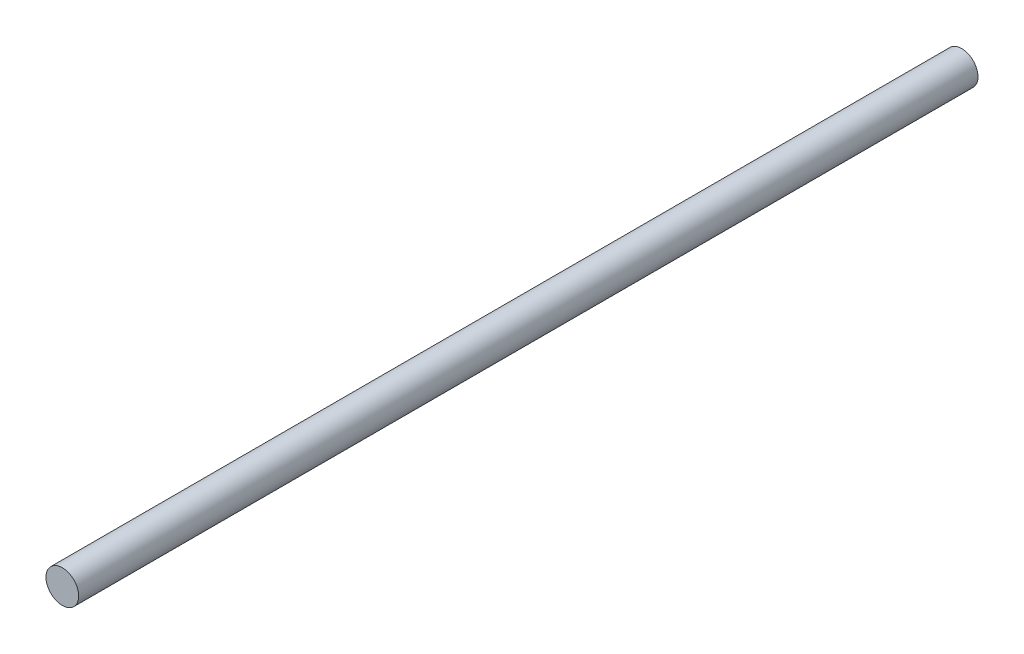
ISO-10303-21;
HEADER;
FILE_DESCRIPTION(('STEP AP214'),'2;1');
FILE_NAME('part.step','',(''),(''),'','','');
FILE_SCHEMA(('AUTOMOTIVE_DESIGN { 1 0 10303 214 1 1 1 1 }'));
ENDSEC;
DATA;
#1=APPLICATION_CONTEXT('core data for automotive mechanical design processes');
#2=APPLICATION_PROTOCOL_DEFINITION('international standard','automotive_design',2000,#1);
#3=PRODUCT_CONTEXT('',#1,'mechanical');
#4=PRODUCT('Part','Part','',(#3));
#5=PRODUCT_RELATED_PRODUCT_CATEGORY('part','',(#4));
#6=PRODUCT_DEFINITION_FORMATION('','',#4);
#7=PRODUCT_DEFINITION_CONTEXT('part definition',#1,'design');
#8=PRODUCT_DEFINITION('design','',#6,#7);
#9=PRODUCT_DEFINITION_SHAPE('','',#8);
#10=(LENGTH_UNIT() NAMED_UNIT(*) SI_UNIT(.MILLI.,.METRE.));
#11=(NAMED_UNIT(*) PLANE_ANGLE_UNIT() SI_UNIT($,.RADIAN.));
#12=(NAMED_UNIT(*) SI_UNIT($,.STERADIAN.) SOLID_ANGLE_UNIT());
#13=UNCERTAINTY_MEASURE_WITH_UNIT(LENGTH_MEASURE(1.E-05),#10,'distance_accuracy_value','');
#14=(GEOMETRIC_REPRESENTATION_CONTEXT(3) GLOBAL_UNCERTAINTY_ASSIGNED_CONTEXT((#13)) GLOBAL_UNIT_ASSIGNED_CONTEXT((#10,
#11,#12)) REPRESENTATION_CONTEXT('',''));
#15=CARTESIAN_POINT('',(0.,0.,0.));
#16=DIRECTION('',(0.,0.,1.));
#17=DIRECTION('',(1.,0.,0.));
#18=AXIS2_PLACEMENT_3D('',#15,#16,#17);
#19=CARTESIAN_POINT('',(0.,0.,220.));
#20=DIRECTION('',(0.,0.,-1.));
#21=DIRECTION('',(-1.,0.,0.));
#22=AXIS2_PLACEMENT_3D('',#19,#20,#21);
#23=CYLINDRICAL_SURFACE('',#22,4.);
#24=CARTESIAN_POINT('',(0.,0.,220.));
#25=DIRECTION('',(0.,0.,1.));
#26=DIRECTION('',(1.,0.,0.));
#27=AXIS2_PLACEMENT_3D('',#24,#25,#26);
#28=CIRCLE('',#27,4.);
#29=CARTESIAN_POINT('',(4.,0.,220.));
#30=VERTEX_POINT('',#29);
#31=EDGE_CURVE('E10',#30,#30,#28,.T.);
#32=ORIENTED_EDGE('',*,*,#31,.F.);
#33=EDGE_LOOP('',(#32));
#34=FACE_BOUND('',#33,.T.);
#35=CARTESIAN_POINT('',(0.,0.,0.));
#36=DIRECTION('',(0.,0.,1.));
#37=DIRECTION('',(1.,0.,0.));
#38=AXIS2_PLACEMENT_3D('',#35,#36,#37);
#39=CIRCLE('',#38,4.);
#40=CARTESIAN_POINT('',(4.,0.,0.));
#41=VERTEX_POINT('',#40);
#42=EDGE_CURVE('E46',#41,#41,#39,.T.);
#43=ORIENTED_EDGE('',*,*,#42,.T.);
#44=EDGE_LOOP('',(#43));
#45=FACE_BOUND('',#44,.T.);
#46=ADVANCED_FACE('F43',(#34,#45),#23,.T.);
#47=CARTESIAN_POINT('',(0.,0.,220.));
#48=DIRECTION('',(0.,0.,1.));
#49=DIRECTION('',(1.,0.,0.));
#50=AXIS2_PLACEMENT_3D('',#47,#48,#49);
#51=PLANE('',#50);
#52=ORIENTED_EDGE('',*,*,#31,.T.);
#53=EDGE_LOOP('',(#52));
#54=FACE_BOUND('',#53,.T.);
#55=ADVANCED_FACE('F58',(#54),#51,.T.);
#56=CARTESIAN_POINT('',(0.,0.,0.));
#57=DIRECTION('',(0.,0.,1.));
#58=DIRECTION('',(1.,0.,0.));
#59=AXIS2_PLACEMENT_3D('',#56,#57,#58);
#60=PLANE('',#59);
#61=ORIENTED_EDGE('',*,*,#42,.F.);
#62=EDGE_LOOP('',(#61));
#63=FACE_BOUND('',#62,.T.);
#64=ADVANCED_FACE('F59',(#63),#60,.F.);
#65=CLOSED_SHELL('',(#46,#55,#64));
#66=MANIFOLD_SOLID_BREP('B2',#65);
#67=ADVANCED_BREP_SHAPE_REPRESENTATION('',(#18,#66),#14);
#68=SHAPE_DEFINITION_REPRESENTATION(#9,#67);
ENDSEC;
END-ISO-10303-21;
